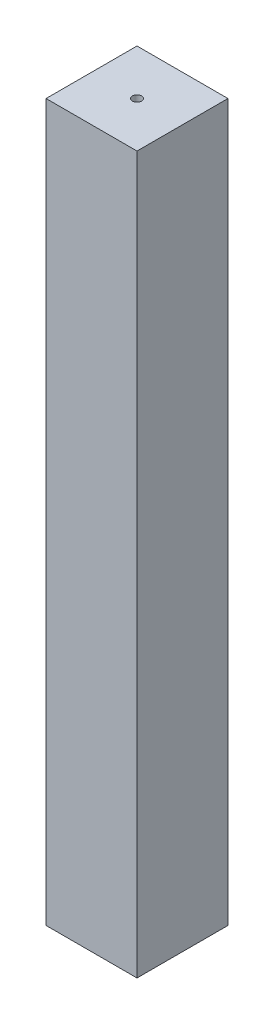
ISO-10303-21;
HEADER;
FILE_DESCRIPTION(('STEP AP214'),'2;1');
FILE_NAME('part.step','',(''),(''),'','','');
FILE_SCHEMA(('AUTOMOTIVE_DESIGN { 1 0 10303 214 1 1 1 1 }'));
ENDSEC;
DATA;
#1=APPLICATION_CONTEXT('core data for automotive mechanical design processes');
#2=APPLICATION_PROTOCOL_DEFINITION('international standard','automotive_design',2000,#1);
#3=PRODUCT_CONTEXT('',#1,'mechanical');
#4=PRODUCT('Part','Part','',(#3));
#5=PRODUCT_RELATED_PRODUCT_CATEGORY('part','',(#4));
#6=PRODUCT_DEFINITION_FORMATION('','',#4);
#7=PRODUCT_DEFINITION_CONTEXT('part definition',#1,'design');
#8=PRODUCT_DEFINITION('design','',#6,#7);
#9=PRODUCT_DEFINITION_SHAPE('','',#8);
#10=(LENGTH_UNIT() NAMED_UNIT(*) SI_UNIT(.MILLI.,.METRE.));
#11=(NAMED_UNIT(*) PLANE_ANGLE_UNIT() SI_UNIT($,.RADIAN.));
#12=(NAMED_UNIT(*) SI_UNIT($,.STERADIAN.) SOLID_ANGLE_UNIT());
#13=UNCERTAINTY_MEASURE_WITH_UNIT(LENGTH_MEASURE(1.E-05),#10,'distance_accuracy_value','');
#14=(GEOMETRIC_REPRESENTATION_CONTEXT(3) GLOBAL_UNCERTAINTY_ASSIGNED_CONTEXT((#13)) GLOBAL_UNIT_ASSIGNED_CONTEXT((#10,
#11,#12)) REPRESENTATION_CONTEXT('',''));
#15=CARTESIAN_POINT('',(0.,0.,0.));
#16=DIRECTION('',(0.,0.,1.));
#17=DIRECTION('',(1.,0.,0.));
#18=AXIS2_PLACEMENT_3D('',#15,#16,#17);
#19=CARTESIAN_POINT('',(25.4,400.05,-25.4));
#20=DIRECTION('',(-1.,0.,0.));
#21=DIRECTION('',(0.,0.,1.));
#22=AXIS2_PLACEMENT_3D('',#19,#20,#21);
#23=PLANE('',#22);
#24=DIRECTION('',(0.,0.,-1.));
#25=VECTOR('',#24,1.);
#26=CARTESIAN_POINT('',(25.4,0.,-25.4));
#27=LINE('',#26,#25);
#28=CARTESIAN_POINT('',(25.4,0.,25.4));
#29=VERTEX_POINT('',#28);
#30=CARTESIAN_POINT('',(25.4,0.,-25.4));
#31=VERTEX_POINT('',#30);
#32=EDGE_CURVE('E94',#29,#31,#27,.T.);
#33=ORIENTED_EDGE('',*,*,#32,.T.);
#34=DIRECTION('',(0.,-1.,0.));
#35=VECTOR('',#34,1.);
#36=CARTESIAN_POINT('',(25.4,400.05,-25.4));
#37=LINE('',#36,#35);
#38=CARTESIAN_POINT('',(25.4,400.05,-25.4));
#39=VERTEX_POINT('',#38);
#40=EDGE_CURVE('E11',#39,#31,#37,.T.);
#41=ORIENTED_EDGE('',*,*,#40,.F.);
#42=DIRECTION('',(0.,0.,-1.));
#43=VECTOR('',#42,1.);
#44=CARTESIAN_POINT('',(25.4,400.05,-25.4));
#45=LINE('',#44,#43);
#46=CARTESIAN_POINT('',(25.4,400.05,25.4));
#47=VERTEX_POINT('',#46);
#48=EDGE_CURVE('E103',#47,#39,#45,.T.);
#49=ORIENTED_EDGE('',*,*,#48,.F.);
#50=DIRECTION('',(0.,-1.,0.));
#51=VECTOR('',#50,1.);
#52=CARTESIAN_POINT('',(25.4,400.05,25.4));
#53=LINE('',#52,#51);
#54=EDGE_CURVE('E108',#47,#29,#53,.T.);
#55=ORIENTED_EDGE('',*,*,#54,.T.);
#56=EDGE_LOOP('',(#33,#41,#49,#55));
#57=FACE_BOUND('',#56,.T.);
#58=ADVANCED_FACE('F33',(#57),#23,.F.);
#59=CARTESIAN_POINT('',(-25.4,400.05,-25.4));
#60=DIRECTION('',(0.,0.,1.));
#61=DIRECTION('',(1.,0.,0.));
#62=AXIS2_PLACEMENT_3D('',#59,#60,#61);
#63=PLANE('',#62);
#64=DIRECTION('',(-1.,0.,0.));
#65=VECTOR('',#64,1.);
#66=CARTESIAN_POINT('',(-25.4,0.,-25.4));
#67=LINE('',#66,#65);
#68=CARTESIAN_POINT('',(-25.4,0.,-25.4));
#69=VERTEX_POINT('',#68);
#70=EDGE_CURVE('E98',#31,#69,#67,.T.);
#71=ORIENTED_EDGE('',*,*,#70,.T.);
#72=DIRECTION('',(0.,-1.,0.));
#73=VECTOR('',#72,1.);
#74=CARTESIAN_POINT('',(-25.4,400.05,-25.4));
#75=LINE('',#74,#73);
#76=CARTESIAN_POINT('',(-25.4,400.05,-25.4));
#77=VERTEX_POINT('',#76);
#78=EDGE_CURVE('E41',#77,#69,#75,.T.);
#79=ORIENTED_EDGE('',*,*,#78,.F.);
#80=DIRECTION('',(-1.,0.,0.));
#81=VECTOR('',#80,1.);
#82=CARTESIAN_POINT('',(-25.4,400.05,-25.4));
#83=LINE('',#82,#81);
#84=EDGE_CURVE('E80',#39,#77,#83,.T.);
#85=ORIENTED_EDGE('',*,*,#84,.F.);
#86=ORIENTED_EDGE('',*,*,#40,.T.);
#87=EDGE_LOOP('',(#71,#79,#85,#86));
#88=FACE_BOUND('',#87,.T.);
#89=ADVANCED_FACE('F133',(#88),#63,.F.);
#90=CARTESIAN_POINT('',(-25.4,400.05,-25.4));
#91=DIRECTION('',(1.,0.,0.));
#92=DIRECTION('',(0.,0.,-1.));
#93=AXIS2_PLACEMENT_3D('',#90,#91,#92);
#94=PLANE('',#93);
#95=DIRECTION('',(0.,0.,1.));
#96=VECTOR('',#95,1.);
#97=CARTESIAN_POINT('',(-25.4,0.,-25.4));
#98=LINE('',#97,#96);
#99=CARTESIAN_POINT('',(-25.4,0.,25.4));
#100=VERTEX_POINT('',#99);
#101=EDGE_CURVE('E67',#69,#100,#98,.T.);
#102=ORIENTED_EDGE('',*,*,#101,.T.);
#103=DIRECTION('',(0.,-1.,0.));
#104=VECTOR('',#103,1.);
#105=CARTESIAN_POINT('',(-25.4,400.05,25.4));
#106=LINE('',#105,#104);
#107=CARTESIAN_POINT('',(-25.4,400.05,25.4));
#108=VERTEX_POINT('',#107);
#109=EDGE_CURVE('E114',#108,#100,#106,.T.);
#110=ORIENTED_EDGE('',*,*,#109,.F.);
#111=DIRECTION('',(0.,0.,1.));
#112=VECTOR('',#111,1.);
#113=CARTESIAN_POINT('',(-25.4,400.05,-25.4));
#114=LINE('',#113,#112);
#115=EDGE_CURVE('E106',#77,#108,#114,.T.);
#116=ORIENTED_EDGE('',*,*,#115,.F.);
#117=ORIENTED_EDGE('',*,*,#78,.T.);
#118=EDGE_LOOP('',(#102,#110,#116,#117));
#119=FACE_BOUND('',#118,.T.);
#120=ADVANCED_FACE('F116',(#119),#94,.F.);
#121=CARTESIAN_POINT('',(-25.4,400.05,25.4));
#122=DIRECTION('',(0.,0.,-1.));
#123=DIRECTION('',(-1.,0.,0.));
#124=AXIS2_PLACEMENT_3D('',#121,#122,#123);
#125=PLANE('',#124);
#126=DIRECTION('',(1.,0.,0.));
#127=VECTOR('',#126,1.);
#128=CARTESIAN_POINT('',(-25.4,0.,25.4));
#129=LINE('',#128,#127);
#130=EDGE_CURVE('E73',#100,#29,#129,.T.);
#131=ORIENTED_EDGE('',*,*,#130,.T.);
#132=ORIENTED_EDGE('',*,*,#54,.F.);
#133=DIRECTION('',(1.,0.,0.));
#134=VECTOR('',#133,1.);
#135=CARTESIAN_POINT('',(-25.4,400.05,25.4));
#136=LINE('',#135,#134);
#137=EDGE_CURVE('E49',#108,#47,#136,.T.);
#138=ORIENTED_EDGE('',*,*,#137,.F.);
#139=ORIENTED_EDGE('',*,*,#109,.T.);
#140=EDGE_LOOP('',(#131,#132,#138,#139));
#141=FACE_BOUND('',#140,.T.);
#142=ADVANCED_FACE('F122',(#141),#125,.F.);
#143=CARTESIAN_POINT('',(0.,400.05,0.));
#144=DIRECTION('',(0.,1.,0.));
#145=DIRECTION('',(0.,0.,1.));
#146=AXIS2_PLACEMENT_3D('',#143,#144,#145);
#147=PLANE('',#146);
#148=CARTESIAN_POINT('',(0.,400.05,0.));
#149=DIRECTION('',(0.,1.,0.));
#150=DIRECTION('',(0.,0.,1.));
#151=AXIS2_PLACEMENT_3D('',#148,#149,#150);
#152=CIRCLE('',#151,2.5527);
#153=CARTESIAN_POINT('',(0.,400.05,2.5527));
#154=VERTEX_POINT('',#153);
#155=EDGE_CURVE('E95',#154,#154,#152,.T.);
#156=ORIENTED_EDGE('',*,*,#155,.F.);
#157=EDGE_LOOP('',(#156));
#158=FACE_BOUND('',#157,.T.);
#159=ORIENTED_EDGE('',*,*,#48,.T.);
#160=ORIENTED_EDGE('',*,*,#84,.T.);
#161=ORIENTED_EDGE('',*,*,#115,.T.);
#162=ORIENTED_EDGE('',*,*,#137,.T.);
#163=EDGE_LOOP('',(#159,#160,#161,#162));
#164=FACE_BOUND('',#163,.T.);
#165=ADVANCED_FACE('F124',(#158,#164),#147,.T.);
#166=CARTESIAN_POINT('',(0.,0.,0.));
#167=DIRECTION('',(0.,1.,0.));
#168=DIRECTION('',(0.,0.,1.));
#169=AXIS2_PLACEMENT_3D('',#166,#167,#168);
#170=PLANE('',#169);
#171=ORIENTED_EDGE('',*,*,#32,.F.);
#172=ORIENTED_EDGE('',*,*,#130,.F.);
#173=ORIENTED_EDGE('',*,*,#101,.F.);
#174=ORIENTED_EDGE('',*,*,#70,.F.);
#175=EDGE_LOOP('',(#171,#172,#173,#174));
#176=FACE_BOUND('',#175,.T.);
#177=ADVANCED_FACE('F88',(#176),#170,.F.);
#178=CARTESIAN_POINT('',(0.,374.65,0.));
#179=DIRECTION('',(0.,1.,0.));
#180=DIRECTION('',(0.,0.,1.));
#181=AXIS2_PLACEMENT_3D('',#178,#179,#180);
#182=CONICAL_SURFACE('',#181,2.5527,1.02974425867665);
#183=CARTESIAN_POINT('',(0.,373.116183097808,0.));
#184=VERTEX_POINT('',#183);
#185=VERTEX_LOOP('',#184);
#186=FACE_BOUND('',#185,.T.);
#187=CARTESIAN_POINT('',(0.,374.65,0.));
#188=DIRECTION('',(0.,1.,0.));
#189=DIRECTION('',(0.,0.,1.));
#190=AXIS2_PLACEMENT_3D('',#187,#188,#189);
#191=CIRCLE('',#190,2.5527);
#192=CARTESIAN_POINT('',(0.,374.65,2.5527));
#193=VERTEX_POINT('',#192);
#194=EDGE_CURVE('E92',#193,#193,#191,.T.);
#195=ORIENTED_EDGE('',*,*,#194,.T.);
#196=EDGE_LOOP('',(#195));
#197=FACE_BOUND('',#196,.T.);
#198=ADVANCED_FACE('F84',(#186,#197),#182,.F.);
#199=CARTESIAN_POINT('',(0.,400.05,0.));
#200=DIRECTION('',(0.,1.,0.));
#201=DIRECTION('',(0.,0.,1.));
#202=AXIS2_PLACEMENT_3D('',#199,#200,#201);
#203=CYLINDRICAL_SURFACE('',#202,2.5527);
#204=ORIENTED_EDGE('',*,*,#194,.F.);
#205=EDGE_LOOP('',(#204));
#206=FACE_BOUND('',#205,.T.);
#207=ORIENTED_EDGE('',*,*,#155,.T.);
#208=EDGE_LOOP('',(#207));
#209=FACE_BOUND('',#208,.T.);
#210=ADVANCED_FACE('F87',(#206,#209),#203,.F.);
#211=CLOSED_SHELL('',(#58,#89,#120,#142,#165,#177,#198,#210));
#212=MANIFOLD_SOLID_BREP('B2',#211);
#213=ADVANCED_BREP_SHAPE_REPRESENTATION('',(#18,#212),#14);
#214=SHAPE_DEFINITION_REPRESENTATION(#9,#213);
ENDSEC;
END-ISO-10303-21;
